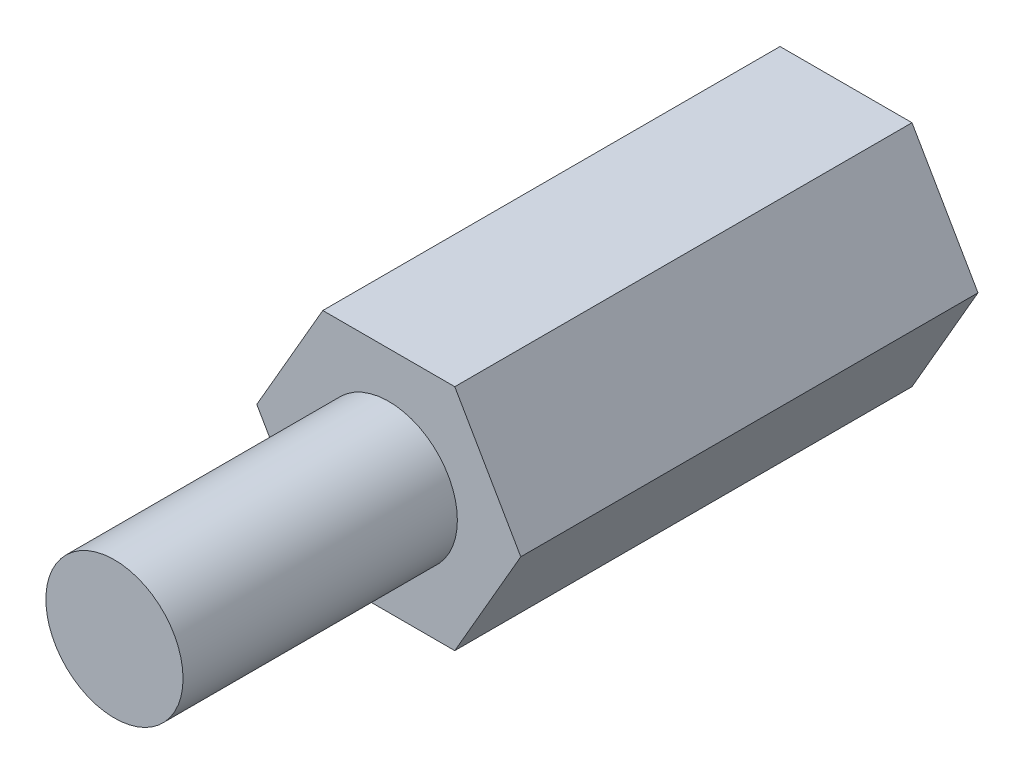
ISO-10303-21;
HEADER;
FILE_DESCRIPTION(('STEP AP214'),'2;1');
FILE_NAME('part.step','',(''),(''),'','','');
FILE_SCHEMA(('AUTOMOTIVE_DESIGN { 1 0 10303 214 1 1 1 1 }'));
ENDSEC;
DATA;
#1=APPLICATION_CONTEXT('core data for automotive mechanical design processes');
#2=APPLICATION_PROTOCOL_DEFINITION('international standard','automotive_design',2000,#1);
#3=PRODUCT_CONTEXT('',#1,'mechanical');
#4=PRODUCT('Part','Part','',(#3));
#5=PRODUCT_RELATED_PRODUCT_CATEGORY('part','',(#4));
#6=PRODUCT_DEFINITION_FORMATION('','',#4);
#7=PRODUCT_DEFINITION_CONTEXT('part definition',#1,'design');
#8=PRODUCT_DEFINITION('design','',#6,#7);
#9=PRODUCT_DEFINITION_SHAPE('','',#8);
#10=(LENGTH_UNIT() NAMED_UNIT(*) SI_UNIT(.MILLI.,.METRE.));
#11=(NAMED_UNIT(*) PLANE_ANGLE_UNIT() SI_UNIT($,.RADIAN.));
#12=(NAMED_UNIT(*) SI_UNIT($,.STERADIAN.) SOLID_ANGLE_UNIT());
#13=UNCERTAINTY_MEASURE_WITH_UNIT(LENGTH_MEASURE(1.E-05),#10,'distance_accuracy_value','');
#14=(GEOMETRIC_REPRESENTATION_CONTEXT(3) GLOBAL_UNCERTAINTY_ASSIGNED_CONTEXT((#13)) GLOBAL_UNIT_ASSIGNED_CONTEXT((#10,
#11,#12)) REPRESENTATION_CONTEXT('',''));
#15=CARTESIAN_POINT('',(0.,0.,0.));
#16=DIRECTION('',(0.,0.,1.));
#17=DIRECTION('',(1.,0.,0.));
#18=AXIS2_PLACEMENT_3D('',#15,#16,#17);
#19=CARTESIAN_POINT('',(1.44337567297407,-2.50000000000001,10.));
#20=DIRECTION('',(0.,0.,1.));
#21=DIRECTION('',(1.,0.,0.));
#22=AXIS2_PLACEMENT_3D('',#19,#20,#21);
#23=PLANE('',#22);
#24=DIRECTION('',(1.,0.,0.));
#25=VECTOR('',#24,1.);
#26=CARTESIAN_POINT('',(-1.44337567297407,-2.5,10.));
#27=LINE('',#26,#25);
#28=CARTESIAN_POINT('',(-1.44337567297407,-2.5,10.));
#29=VERTEX_POINT('',#28);
#30=CARTESIAN_POINT('',(1.44337567297406,-2.50000000000001,10.));
#31=VERTEX_POINT('',#30);
#32=EDGE_CURVE('E139',#29,#31,#27,.T.);
#33=ORIENTED_EDGE('',*,*,#32,.T.);
#34=DIRECTION('',(0.499999999999999,0.866025403784439,0.));
#35=VECTOR('',#34,1.);
#36=CARTESIAN_POINT('',(1.44337567297406,-2.50000000000001,10.));
#37=LINE('',#36,#35);
#38=CARTESIAN_POINT('',(2.88675134594814,0.,10.));
#39=VERTEX_POINT('',#38);
#40=EDGE_CURVE('E96',#31,#39,#37,.T.);
#41=ORIENTED_EDGE('',*,*,#40,.T.);
#42=DIRECTION('',(-0.5,0.866025403784439,0.));
#43=VECTOR('',#42,1.);
#44=CARTESIAN_POINT('',(2.88675134594814,0.,10.));
#45=LINE('',#44,#43);
#46=CARTESIAN_POINT('',(1.44337567297407,2.50000000000002,10.));
#47=VERTEX_POINT('',#46);
#48=EDGE_CURVE('E110',#39,#47,#45,.T.);
#49=ORIENTED_EDGE('',*,*,#48,.T.);
#50=DIRECTION('',(-1.,0.,0.));
#51=VECTOR('',#50,1.);
#52=CARTESIAN_POINT('',(1.44337567297407,2.50000000000002,10.));
#53=LINE('',#52,#51);
#54=CARTESIAN_POINT('',(-1.44337567297407,2.50000000000002,10.));
#55=VERTEX_POINT('',#54);
#56=EDGE_CURVE('E104',#47,#55,#53,.T.);
#57=ORIENTED_EDGE('',*,*,#56,.T.);
#58=DIRECTION('',(-0.500000000000001,-0.866025403784438,0.));
#59=VECTOR('',#58,1.);
#60=CARTESIAN_POINT('',(-1.44337567297407,2.50000000000002,10.));
#61=LINE('',#60,#59);
#62=CARTESIAN_POINT('',(-2.88675134594814,0.,10.));
#63=VERTEX_POINT('',#62);
#64=EDGE_CURVE('E108',#55,#63,#61,.T.);
#65=ORIENTED_EDGE('',*,*,#64,.T.);
#66=DIRECTION('',(0.5,-0.866025403784439,0.));
#67=VECTOR('',#66,1.);
#68=CARTESIAN_POINT('',(-2.88675134594814,0.,10.));
#69=LINE('',#68,#67);
#70=EDGE_CURVE('E58',#63,#29,#69,.T.);
#71=ORIENTED_EDGE('',*,*,#70,.T.);
#72=EDGE_LOOP('',(#33,#41,#49,#57,#65,#71));
#73=FACE_BOUND('',#72,.T.);
#74=CARTESIAN_POINT('',(0.,0.,10.));
#75=DIRECTION('',(0.,0.,1.));
#76=DIRECTION('',(1.,0.,0.));
#77=AXIS2_PLACEMENT_3D('',#74,#75,#76);
#78=CIRCLE('',#77,1.5);
#79=CARTESIAN_POINT('',(1.5,0.,10.));
#80=VERTEX_POINT('',#79);
#81=EDGE_CURVE('E194',#80,#80,#78,.T.);
#82=ORIENTED_EDGE('',*,*,#81,.F.);
#83=EDGE_LOOP('',(#82));
#84=FACE_BOUND('',#83,.T.);
#85=ADVANCED_FACE('F41',(#73,#84),#23,.T.);
#86=CARTESIAN_POINT('',(-1.44337567297407,-2.5,10.));
#87=DIRECTION('',(0.,1.,0.));
#88=DIRECTION('',(-1.,0.,0.));
#89=AXIS2_PLACEMENT_3D('',#86,#87,#88);
#90=PLANE('',#89);
#91=DIRECTION('',(1.,0.,0.));
#92=VECTOR('',#91,1.);
#93=CARTESIAN_POINT('',(-1.44337567297407,-2.5,0.));
#94=LINE('',#93,#92);
#95=CARTESIAN_POINT('',(-1.44337567297407,-2.5,0.));
#96=VERTEX_POINT('',#95);
#97=CARTESIAN_POINT('',(1.44337567297406,-2.50000000000001,0.));
#98=VERTEX_POINT('',#97);
#99=EDGE_CURVE('E128',#96,#98,#94,.T.);
#100=ORIENTED_EDGE('',*,*,#99,.T.);
#101=DIRECTION('',(0.,0.,-1.));
#102=VECTOR('',#101,1.);
#103=CARTESIAN_POINT('',(1.44337567297406,-2.50000000000001,10.));
#104=LINE('',#103,#102);
#105=EDGE_CURVE('E11',#31,#98,#104,.T.);
#106=ORIENTED_EDGE('',*,*,#105,.F.);
#107=ORIENTED_EDGE('',*,*,#32,.F.);
#108=DIRECTION('',(0.,0.,-1.));
#109=VECTOR('',#108,1.);
#110=CARTESIAN_POINT('',(-1.44337567297407,-2.5,10.));
#111=LINE('',#110,#109);
#112=EDGE_CURVE('E124',#29,#96,#111,.T.);
#113=ORIENTED_EDGE('',*,*,#112,.T.);
#114=EDGE_LOOP('',(#100,#106,#107,#113));
#115=FACE_BOUND('',#114,.T.);
#116=ADVANCED_FACE('F43',(#115),#90,.F.);
#117=CARTESIAN_POINT('',(1.44337567297406,-2.50000000000001,10.));
#118=DIRECTION('',(-0.866025403784439,0.499999999999999,0.));
#119=DIRECTION('',(-0.499999999999999,-0.866025403784439,0.));
#120=AXIS2_PLACEMENT_3D('',#117,#118,#119);
#121=PLANE('',#120);
#122=DIRECTION('',(0.499999999999999,0.866025403784439,0.));
#123=VECTOR('',#122,1.);
#124=CARTESIAN_POINT('',(1.44337567297406,-2.50000000000001,0.));
#125=LINE('',#124,#123);
#126=CARTESIAN_POINT('',(2.88675134594814,0.,0.));
#127=VERTEX_POINT('',#126);
#128=EDGE_CURVE('E131',#98,#127,#125,.T.);
#129=ORIENTED_EDGE('',*,*,#128,.T.);
#130=DIRECTION('',(0.,0.,-1.));
#131=VECTOR('',#130,1.);
#132=CARTESIAN_POINT('',(2.88675134594814,0.,10.));
#133=LINE('',#132,#131);
#134=EDGE_CURVE('E50',#39,#127,#133,.T.);
#135=ORIENTED_EDGE('',*,*,#134,.F.);
#136=ORIENTED_EDGE('',*,*,#40,.F.);
#137=ORIENTED_EDGE('',*,*,#105,.T.);
#138=EDGE_LOOP('',(#129,#135,#136,#137));
#139=FACE_BOUND('',#138,.T.);
#140=ADVANCED_FACE('F168',(#139),#121,.F.);
#141=CARTESIAN_POINT('',(2.88675134594814,0.,10.));
#142=DIRECTION('',(-0.866025403784439,-0.5,0.));
#143=DIRECTION('',(0.5,-0.866025403784439,0.));
#144=AXIS2_PLACEMENT_3D('',#141,#142,#143);
#145=PLANE('',#144);
#146=DIRECTION('',(-0.5,0.866025403784439,0.));
#147=VECTOR('',#146,1.);
#148=CARTESIAN_POINT('',(2.88675134594814,0.,0.));
#149=LINE('',#148,#147);
#150=CARTESIAN_POINT('',(1.44337567297407,2.50000000000002,0.));
#151=VERTEX_POINT('',#150);
#152=EDGE_CURVE('E134',#127,#151,#149,.T.);
#153=ORIENTED_EDGE('',*,*,#152,.T.);
#154=DIRECTION('',(0.,0.,-1.));
#155=VECTOR('',#154,1.);
#156=CARTESIAN_POINT('',(1.44337567297407,2.50000000000002,10.));
#157=LINE('',#156,#155);
#158=EDGE_CURVE('E119',#47,#151,#157,.T.);
#159=ORIENTED_EDGE('',*,*,#158,.F.);
#160=ORIENTED_EDGE('',*,*,#48,.F.);
#161=ORIENTED_EDGE('',*,*,#134,.T.);
#162=EDGE_LOOP('',(#153,#159,#160,#161));
#163=FACE_BOUND('',#162,.T.);
#164=ADVANCED_FACE('F145',(#163),#145,.F.);
#165=CARTESIAN_POINT('',(1.44337567297407,2.50000000000002,10.));
#166=DIRECTION('',(0.,-1.,0.));
#167=DIRECTION('',(1.,0.,0.));
#168=AXIS2_PLACEMENT_3D('',#165,#166,#167);
#169=PLANE('',#168);
#170=DIRECTION('',(-1.,0.,0.));
#171=VECTOR('',#170,1.);
#172=CARTESIAN_POINT('',(1.44337567297407,2.50000000000002,0.));
#173=LINE('',#172,#171);
#174=CARTESIAN_POINT('',(-1.44337567297407,2.50000000000002,0.));
#175=VERTEX_POINT('',#174);
#176=EDGE_CURVE('E118',#151,#175,#173,.T.);
#177=ORIENTED_EDGE('',*,*,#176,.T.);
#178=DIRECTION('',(0.,0.,-1.));
#179=VECTOR('',#178,1.);
#180=CARTESIAN_POINT('',(-1.44337567297407,2.50000000000002,10.));
#181=LINE('',#180,#179);
#182=EDGE_CURVE('E115',#55,#175,#181,.T.);
#183=ORIENTED_EDGE('',*,*,#182,.F.);
#184=ORIENTED_EDGE('',*,*,#56,.F.);
#185=ORIENTED_EDGE('',*,*,#158,.T.);
#186=EDGE_LOOP('',(#177,#183,#184,#185));
#187=FACE_BOUND('',#186,.T.);
#188=ADVANCED_FACE('F116',(#187),#169,.F.);
#189=CARTESIAN_POINT('',(-1.44337567297407,2.50000000000002,10.));
#190=DIRECTION('',(0.866025403784438,-0.500000000000001,0.));
#191=DIRECTION('',(0.500000000000001,0.866025403784438,0.));
#192=AXIS2_PLACEMENT_3D('',#189,#190,#191);
#193=PLANE('',#192);
#194=DIRECTION('',(-0.500000000000001,-0.866025403784438,0.));
#195=VECTOR('',#194,1.);
#196=CARTESIAN_POINT('',(-1.44337567297407,2.50000000000002,0.));
#197=LINE('',#196,#195);
#198=CARTESIAN_POINT('',(-2.88675134594814,0.,0.));
#199=VERTEX_POINT('',#198);
#200=EDGE_CURVE('E82',#175,#199,#197,.T.);
#201=ORIENTED_EDGE('',*,*,#200,.T.);
#202=DIRECTION('',(0.,0.,-1.));
#203=VECTOR('',#202,1.);
#204=CARTESIAN_POINT('',(-2.88675134594814,0.,10.));
#205=LINE('',#204,#203);
#206=EDGE_CURVE('E120',#63,#199,#205,.T.);
#207=ORIENTED_EDGE('',*,*,#206,.F.);
#208=ORIENTED_EDGE('',*,*,#64,.F.);
#209=ORIENTED_EDGE('',*,*,#182,.T.);
#210=EDGE_LOOP('',(#201,#207,#208,#209));
#211=FACE_BOUND('',#210,.T.);
#212=ADVANCED_FACE('F122',(#211),#193,.F.);
#213=CARTESIAN_POINT('',(-2.88675134594814,0.,10.));
#214=DIRECTION('',(0.866025403784439,0.5,0.));
#215=DIRECTION('',(-0.5,0.866025403784439,0.));
#216=AXIS2_PLACEMENT_3D('',#213,#214,#215);
#217=PLANE('',#216);
#218=DIRECTION('',(0.5,-0.866025403784439,0.));
#219=VECTOR('',#218,1.);
#220=CARTESIAN_POINT('',(-2.88675134594814,0.,0.));
#221=LINE('',#220,#219);
#222=EDGE_CURVE('E88',#199,#96,#221,.T.);
#223=ORIENTED_EDGE('',*,*,#222,.T.);
#224=ORIENTED_EDGE('',*,*,#112,.F.);
#225=ORIENTED_EDGE('',*,*,#70,.F.);
#226=ORIENTED_EDGE('',*,*,#206,.T.);
#227=EDGE_LOOP('',(#223,#224,#225,#226));
#228=FACE_BOUND('',#227,.T.);
#229=ADVANCED_FACE('F152',(#228),#217,.F.);
#230=CARTESIAN_POINT('',(1.44337567297407,-2.50000000000001,0.));
#231=DIRECTION('',(0.,0.,1.));
#232=DIRECTION('',(1.,0.,0.));
#233=AXIS2_PLACEMENT_3D('',#230,#231,#232);
#234=PLANE('',#233);
#235=CARTESIAN_POINT('',(0.,0.,0.));
#236=DIRECTION('',(0.,0.,-1.));
#237=DIRECTION('',(-1.,0.,0.));
#238=AXIS2_PLACEMENT_3D('',#235,#236,#237);
#239=CIRCLE('',#238,1.24999999999999);
#240=CARTESIAN_POINT('',(-1.24999999999999,0.,0.));
#241=VERTEX_POINT('',#240);
#242=EDGE_CURVE('E191',#241,#241,#239,.T.);
#243=ORIENTED_EDGE('',*,*,#242,.F.);
#244=EDGE_LOOP('',(#243));
#245=FACE_BOUND('',#244,.T.);
#246=ORIENTED_EDGE('',*,*,#99,.F.);
#247=ORIENTED_EDGE('',*,*,#222,.F.);
#248=ORIENTED_EDGE('',*,*,#200,.F.);
#249=ORIENTED_EDGE('',*,*,#176,.F.);
#250=ORIENTED_EDGE('',*,*,#152,.F.);
#251=ORIENTED_EDGE('',*,*,#128,.F.);
#252=EDGE_LOOP('',(#246,#247,#248,#249,#250,#251));
#253=FACE_BOUND('',#252,.T.);
#254=ADVANCED_FACE('F148',(#245,#253),#234,.F.);
#255=CARTESIAN_POINT('',(0.,0.,16.));
#256=DIRECTION('',(0.,0.,-1.));
#257=DIRECTION('',(-1.,0.,0.));
#258=AXIS2_PLACEMENT_3D('',#255,#256,#257);
#259=CYLINDRICAL_SURFACE('',#258,1.5);
#260=CARTESIAN_POINT('',(0.,0.,16.));
#261=DIRECTION('',(0.,0.,1.));
#262=DIRECTION('',(1.,0.,0.));
#263=AXIS2_PLACEMENT_3D('',#260,#261,#262);
#264=CIRCLE('',#263,1.5);
#265=CARTESIAN_POINT('',(1.5,0.,16.));
#266=VERTEX_POINT('',#265);
#267=EDGE_CURVE('E132',#266,#266,#264,.T.);
#268=ORIENTED_EDGE('',*,*,#267,.F.);
#269=EDGE_LOOP('',(#268));
#270=FACE_BOUND('',#269,.T.);
#271=ORIENTED_EDGE('',*,*,#81,.T.);
#272=EDGE_LOOP('',(#271));
#273=FACE_BOUND('',#272,.T.);
#274=ADVANCED_FACE('F159',(#270,#273),#259,.T.);
#275=CARTESIAN_POINT('',(0.,0.,16.));
#276=DIRECTION('',(0.,0.,1.));
#277=DIRECTION('',(1.,0.,0.));
#278=AXIS2_PLACEMENT_3D('',#275,#276,#277);
#279=PLANE('',#278);
#280=ORIENTED_EDGE('',*,*,#267,.T.);
#281=EDGE_LOOP('',(#280));
#282=FACE_BOUND('',#281,.T.);
#283=ADVANCED_FACE('F172',(#282),#279,.T.);
#284=CARTESIAN_POINT('',(0.,0.,0.));
#285=DIRECTION('',(0.,0.,-1.));
#286=DIRECTION('',(-1.,0.,0.));
#287=AXIS2_PLACEMENT_3D('',#284,#285,#286);
#288=CYLINDRICAL_SURFACE('',#287,1.24999999999999);
#289=CARTESIAN_POINT('',(0.,0.,11.));
#290=DIRECTION('',(0.,0.,-1.));
#291=DIRECTION('',(-1.,0.,0.));
#292=AXIS2_PLACEMENT_3D('',#289,#290,#291);
#293=CIRCLE('',#292,1.25);
#294=CARTESIAN_POINT('',(-1.25,0.,11.));
#295=VERTEX_POINT('',#294);
#296=EDGE_CURVE('E190',#295,#295,#293,.T.);
#297=ORIENTED_EDGE('',*,*,#296,.F.);
#298=EDGE_LOOP('',(#297));
#299=FACE_BOUND('',#298,.T.);
#300=ORIENTED_EDGE('',*,*,#242,.T.);
#301=EDGE_LOOP('',(#300));
#302=FACE_BOUND('',#301,.T.);
#303=ADVANCED_FACE('F176',(#299,#302),#288,.F.);
#304=CARTESIAN_POINT('',(0.,0.,11.));
#305=DIRECTION('',(0.,0.,-1.));
#306=DIRECTION('',(-1.,0.,0.));
#307=AXIS2_PLACEMENT_3D('',#304,#305,#306);
#308=CONICAL_SURFACE('',#307,1.25,1.02974425867665);
#309=CARTESIAN_POINT('',(0.,0.,11.7510757737845));
#310=VERTEX_POINT('',#309);
#311=VERTEX_LOOP('',#310);
#312=FACE_BOUND('',#311,.T.);
#313=ORIENTED_EDGE('',*,*,#296,.T.);
#314=EDGE_LOOP('',(#313));
#315=FACE_BOUND('',#314,.T.);
#316=ADVANCED_FACE('F180',(#312,#315),#308,.F.);
#317=CLOSED_SHELL('',(#85,#116,#140,#164,#188,#212,#229,#254,#274,#283,#303,#316));
#318=MANIFOLD_SOLID_BREP('B2',#317);
#319=ADVANCED_BREP_SHAPE_REPRESENTATION('',(#18,#318),#14);
#320=SHAPE_DEFINITION_REPRESENTATION(#9,#319);
ENDSEC;
END-ISO-10303-21;
